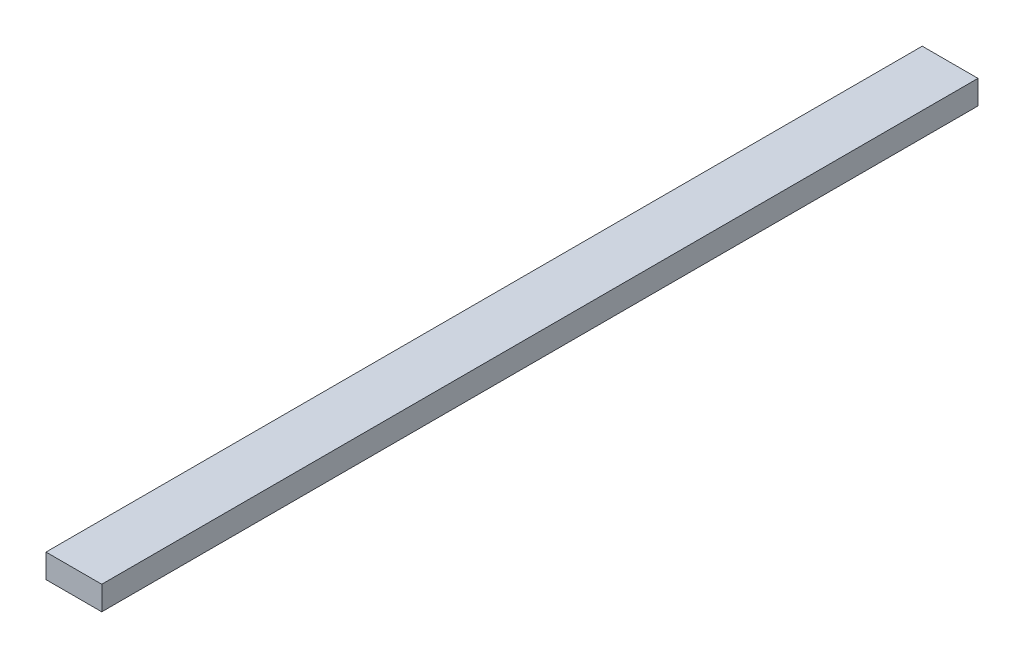
ISO-10303-21;
HEADER;
FILE_DESCRIPTION(('STEP AP214'),'2;1');
FILE_NAME('part.step','',(''),(''),'','','');
FILE_SCHEMA(('AUTOMOTIVE_DESIGN { 1 0 10303 214 1 1 1 1 }'));
ENDSEC;
DATA;
#1=APPLICATION_CONTEXT('core data for automotive mechanical design processes');
#2=APPLICATION_PROTOCOL_DEFINITION('international standard','automotive_design',2000,#1);
#3=PRODUCT_CONTEXT('',#1,'mechanical');
#4=PRODUCT('Part','Part','',(#3));
#5=PRODUCT_RELATED_PRODUCT_CATEGORY('part','',(#4));
#6=PRODUCT_DEFINITION_FORMATION('','',#4);
#7=PRODUCT_DEFINITION_CONTEXT('part definition',#1,'design');
#8=PRODUCT_DEFINITION('design','',#6,#7);
#9=PRODUCT_DEFINITION_SHAPE('','',#8);
#10=(LENGTH_UNIT() NAMED_UNIT(*) SI_UNIT(.MILLI.,.METRE.));
#11=(NAMED_UNIT(*) PLANE_ANGLE_UNIT() SI_UNIT($,.RADIAN.));
#12=(NAMED_UNIT(*) SI_UNIT($,.STERADIAN.) SOLID_ANGLE_UNIT());
#13=UNCERTAINTY_MEASURE_WITH_UNIT(LENGTH_MEASURE(1.E-05),#10,'distance_accuracy_value','');
#14=(GEOMETRIC_REPRESENTATION_CONTEXT(3) GLOBAL_UNCERTAINTY_ASSIGNED_CONTEXT((#13)) GLOBAL_UNIT_ASSIGNED_CONTEXT((#10,
#11,#12)) REPRESENTATION_CONTEXT('',''));
#15=CARTESIAN_POINT('',(0.,0.,0.));
#16=DIRECTION('',(0.,0.,1.));
#17=DIRECTION('',(1.,0.,0.));
#18=AXIS2_PLACEMENT_3D('',#15,#16,#17);
#19=CARTESIAN_POINT('',(-44.45,19.05,698.5));
#20=DIRECTION('',(1.,0.,0.));
#21=DIRECTION('',(0.,0.,-1.));
#22=AXIS2_PLACEMENT_3D('',#19,#20,#21);
#23=PLANE('',#22);
#24=DIRECTION('',(0.,-1.,0.));
#25=VECTOR('',#24,1.);
#26=CARTESIAN_POINT('',(-44.45,19.05,-698.5));
#27=LINE('',#26,#25);
#28=CARTESIAN_POINT('',(-44.45,19.05,-698.5));
#29=VERTEX_POINT('',#28);
#30=CARTESIAN_POINT('',(-44.45,-19.05,-698.5));
#31=VERTEX_POINT('',#30);
#32=EDGE_CURVE('E96',#29,#31,#27,.T.);
#33=ORIENTED_EDGE('',*,*,#32,.T.);
#34=DIRECTION('',(0.,0.,-1.));
#35=VECTOR('',#34,1.);
#36=CARTESIAN_POINT('',(-44.45,-19.05,698.5));
#37=LINE('',#36,#35);
#38=CARTESIAN_POINT('',(-44.45,-19.05,698.5));
#39=VERTEX_POINT('',#38);
#40=EDGE_CURVE('E11',#39,#31,#37,.T.);
#41=ORIENTED_EDGE('',*,*,#40,.F.);
#42=DIRECTION('',(0.,-1.,0.));
#43=VECTOR('',#42,1.);
#44=CARTESIAN_POINT('',(-44.45,19.05,698.5));
#45=LINE('',#44,#43);
#46=CARTESIAN_POINT('',(-44.45,19.05,698.5));
#47=VERTEX_POINT('',#46);
#48=EDGE_CURVE('E84',#47,#39,#45,.T.);
#49=ORIENTED_EDGE('',*,*,#48,.F.);
#50=DIRECTION('',(0.,0.,-1.));
#51=VECTOR('',#50,1.);
#52=CARTESIAN_POINT('',(-44.45,19.05,698.5));
#53=LINE('',#52,#51);
#54=EDGE_CURVE('E92',#47,#29,#53,.T.);
#55=ORIENTED_EDGE('',*,*,#54,.T.);
#56=EDGE_LOOP('',(#33,#41,#49,#55));
#57=FACE_BOUND('',#56,.T.);
#58=ADVANCED_FACE('F33',(#57),#23,.F.);
#59=CARTESIAN_POINT('',(44.45,-19.05,698.5));
#60=DIRECTION('',(0.,1.,0.));
#61=DIRECTION('',(-1.,0.,0.));
#62=AXIS2_PLACEMENT_3D('',#59,#60,#61);
#63=PLANE('',#62);
#64=DIRECTION('',(1.,0.,0.));
#65=VECTOR('',#64,1.);
#66=CARTESIAN_POINT('',(44.45,-19.05,-698.5));
#67=LINE('',#66,#65);
#68=CARTESIAN_POINT('',(44.45,-19.05,-698.5));
#69=VERTEX_POINT('',#68);
#70=EDGE_CURVE('E88',#31,#69,#67,.T.);
#71=ORIENTED_EDGE('',*,*,#70,.T.);
#72=DIRECTION('',(0.,0.,-1.));
#73=VECTOR('',#72,1.);
#74=CARTESIAN_POINT('',(44.45,-19.05,698.5));
#75=LINE('',#74,#73);
#76=CARTESIAN_POINT('',(44.45,-19.05,698.5));
#77=VERTEX_POINT('',#76);
#78=EDGE_CURVE('E41',#77,#69,#75,.T.);
#79=ORIENTED_EDGE('',*,*,#78,.F.);
#80=DIRECTION('',(1.,0.,0.));
#81=VECTOR('',#80,1.);
#82=CARTESIAN_POINT('',(44.45,-19.05,698.5));
#83=LINE('',#82,#81);
#84=EDGE_CURVE('E79',#39,#77,#83,.T.);
#85=ORIENTED_EDGE('',*,*,#84,.F.);
#86=ORIENTED_EDGE('',*,*,#40,.T.);
#87=EDGE_LOOP('',(#71,#79,#85,#86));
#88=FACE_BOUND('',#87,.T.);
#89=ADVANCED_FACE('F87',(#88),#63,.F.);
#90=CARTESIAN_POINT('',(44.45,19.05,698.5));
#91=DIRECTION('',(-1.,0.,0.));
#92=DIRECTION('',(0.,-1.,0.));
#93=AXIS2_PLACEMENT_3D('',#90,#91,#92);
#94=PLANE('',#93);
#95=DIRECTION('',(0.,1.,0.));
#96=VECTOR('',#95,1.);
#97=CARTESIAN_POINT('',(44.45,19.05,-698.5));
#98=LINE('',#97,#96);
#99=CARTESIAN_POINT('',(44.45,19.05,-698.5));
#100=VERTEX_POINT('',#99);
#101=EDGE_CURVE('E66',#69,#100,#98,.T.);
#102=ORIENTED_EDGE('',*,*,#101,.T.);
#103=DIRECTION('',(0.,0.,-1.));
#104=VECTOR('',#103,1.);
#105=CARTESIAN_POINT('',(44.45,19.05,698.5));
#106=LINE('',#105,#104);
#107=CARTESIAN_POINT('',(44.45,19.05,698.5));
#108=VERTEX_POINT('',#107);
#109=EDGE_CURVE('E89',#108,#100,#106,.T.);
#110=ORIENTED_EDGE('',*,*,#109,.F.);
#111=DIRECTION('',(0.,1.,0.));
#112=VECTOR('',#111,1.);
#113=CARTESIAN_POINT('',(44.45,19.05,698.5));
#114=LINE('',#113,#112);
#115=EDGE_CURVE('E82',#77,#108,#114,.T.);
#116=ORIENTED_EDGE('',*,*,#115,.F.);
#117=ORIENTED_EDGE('',*,*,#78,.T.);
#118=EDGE_LOOP('',(#102,#110,#116,#117));
#119=FACE_BOUND('',#118,.T.);
#120=ADVANCED_FACE('F90',(#119),#94,.F.);
#121=CARTESIAN_POINT('',(44.45,19.05,698.5));
#122=DIRECTION('',(0.,-1.,0.));
#123=DIRECTION('',(1.,0.,0.));
#124=AXIS2_PLACEMENT_3D('',#121,#122,#123);
#125=PLANE('',#124);
#126=DIRECTION('',(-1.,0.,0.));
#127=VECTOR('',#126,1.);
#128=CARTESIAN_POINT('',(44.45,19.05,-698.5));
#129=LINE('',#128,#127);
#130=EDGE_CURVE('E72',#100,#29,#129,.T.);
#131=ORIENTED_EDGE('',*,*,#130,.T.);
#132=ORIENTED_EDGE('',*,*,#54,.F.);
#133=DIRECTION('',(-1.,0.,0.));
#134=VECTOR('',#133,1.);
#135=CARTESIAN_POINT('',(44.45,19.05,698.5));
#136=LINE('',#135,#134);
#137=EDGE_CURVE('E49',#108,#47,#136,.T.);
#138=ORIENTED_EDGE('',*,*,#137,.F.);
#139=ORIENTED_EDGE('',*,*,#109,.T.);
#140=EDGE_LOOP('',(#131,#132,#138,#139));
#141=FACE_BOUND('',#140,.T.);
#142=ADVANCED_FACE('F103',(#141),#125,.F.);
#143=CARTESIAN_POINT('',(0.,0.,698.5));
#144=DIRECTION('',(0.,0.,-1.));
#145=DIRECTION('',(-1.,0.,0.));
#146=AXIS2_PLACEMENT_3D('',#143,#144,#145);
#147=PLANE('',#146);
#148=ORIENTED_EDGE('',*,*,#48,.T.);
#149=ORIENTED_EDGE('',*,*,#84,.T.);
#150=ORIENTED_EDGE('',*,*,#115,.T.);
#151=ORIENTED_EDGE('',*,*,#137,.T.);
#152=EDGE_LOOP('',(#148,#149,#150,#151));
#153=FACE_BOUND('',#152,.T.);
#154=ADVANCED_FACE('F80',(#153),#147,.F.);
#155=CARTESIAN_POINT('',(0.,0.,-698.5));
#156=DIRECTION('',(0.,0.,-1.));
#157=DIRECTION('',(-1.,0.,0.));
#158=AXIS2_PLACEMENT_3D('',#155,#156,#157);
#159=PLANE('',#158);
#160=ORIENTED_EDGE('',*,*,#32,.F.);
#161=ORIENTED_EDGE('',*,*,#130,.F.);
#162=ORIENTED_EDGE('',*,*,#101,.F.);
#163=ORIENTED_EDGE('',*,*,#70,.F.);
#164=EDGE_LOOP('',(#160,#161,#162,#163));
#165=FACE_BOUND('',#164,.T.);
#166=ADVANCED_FACE('F106',(#165),#159,.T.);
#167=CLOSED_SHELL('',(#58,#89,#120,#142,#154,#166));
#168=MANIFOLD_SOLID_BREP('B2',#167);
#169=ADVANCED_BREP_SHAPE_REPRESENTATION('',(#18,#168),#14);
#170=SHAPE_DEFINITION_REPRESENTATION(#9,#169);
ENDSEC;
END-ISO-10303-21;
